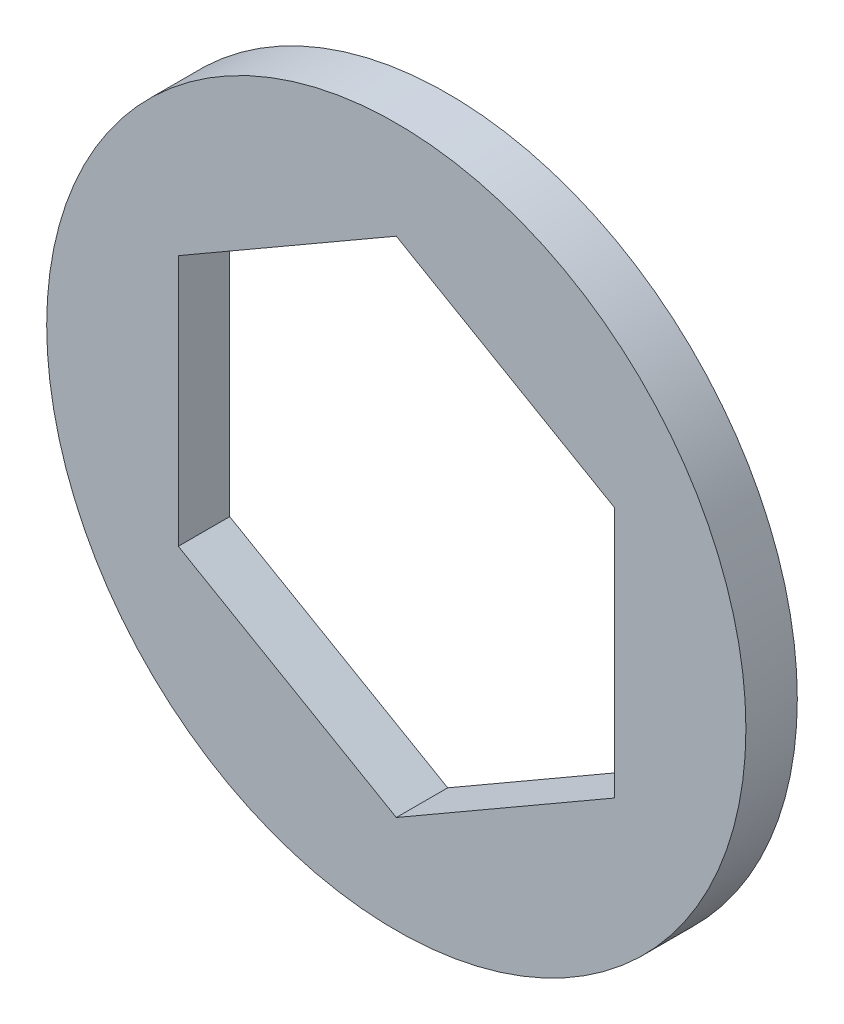
ISO-10303-21;
HEADER;
FILE_DESCRIPTION(('STEP AP214'),'2;1');
FILE_NAME('part.step','',(''),(''),'','','');
FILE_SCHEMA(('AUTOMOTIVE_DESIGN { 1 0 10303 214 1 1 1 1 }'));
ENDSEC;
DATA;
#1=APPLICATION_CONTEXT('core data for automotive mechanical design processes');
#2=APPLICATION_PROTOCOL_DEFINITION('international standard','automotive_design',2000,#1);
#3=PRODUCT_CONTEXT('',#1,'mechanical');
#4=PRODUCT('Part','Part','',(#3));
#5=PRODUCT_RELATED_PRODUCT_CATEGORY('part','',(#4));
#6=PRODUCT_DEFINITION_FORMATION('','',#4);
#7=PRODUCT_DEFINITION_CONTEXT('part definition',#1,'design');
#8=PRODUCT_DEFINITION('design','',#6,#7);
#9=PRODUCT_DEFINITION_SHAPE('','',#8);
#10=(LENGTH_UNIT() NAMED_UNIT(*) SI_UNIT(.MILLI.,.METRE.));
#11=(NAMED_UNIT(*) PLANE_ANGLE_UNIT() SI_UNIT($,.RADIAN.));
#12=(NAMED_UNIT(*) SI_UNIT($,.STERADIAN.) SOLID_ANGLE_UNIT());
#13=UNCERTAINTY_MEASURE_WITH_UNIT(LENGTH_MEASURE(1.E-05),#10,'distance_accuracy_value','');
#14=(GEOMETRIC_REPRESENTATION_CONTEXT(3) GLOBAL_UNCERTAINTY_ASSIGNED_CONTEXT((#13)) GLOBAL_UNIT_ASSIGNED_CONTEXT((#10,
#11,#12)) REPRESENTATION_CONTEXT('',''));
#15=CARTESIAN_POINT('',(0.,0.,0.));
#16=DIRECTION('',(0.,0.,1.));
#17=DIRECTION('',(1.,0.,0.));
#18=AXIS2_PLACEMENT_3D('',#15,#16,#17);
#19=CARTESIAN_POINT('',(0.,0.,1.5875));
#20=DIRECTION('',(0.,0.,1.));
#21=DIRECTION('',(1.,0.,0.));
#22=AXIS2_PLACEMENT_3D('',#19,#20,#21);
#23=PLANE('',#22);
#24=CARTESIAN_POINT('',(0.,0.,1.5875));
#25=DIRECTION('',(0.,0.,1.));
#26=DIRECTION('',(1.,0.,0.));
#27=AXIS2_PLACEMENT_3D('',#24,#25,#26);
#28=CIRCLE('',#27,10.795);
#29=CARTESIAN_POINT('',(10.795,0.,1.5875));
#30=VERTEX_POINT('',#29);
#31=EDGE_CURVE('E11',#30,#30,#28,.T.);
#32=ORIENTED_EDGE('',*,*,#31,.T.);
#33=EDGE_LOOP('',(#32));
#34=FACE_BOUND('',#33,.T.);
#35=DIRECTION('',(-0.866025403784439,-0.5,0.));
#36=VECTOR('',#35,1.);
#37=CARTESIAN_POINT('',(0.,7.77228932383074,1.5875));
#38=LINE('',#37,#36);
#39=CARTESIAN_POINT('',(0.,7.77228932383074,1.5875));
#40=VERTEX_POINT('',#39);
#41=CARTESIAN_POINT('',(-6.731,3.88614466191537,1.5875));
#42=VERTEX_POINT('',#41);
#43=EDGE_CURVE('E98',#40,#42,#38,.T.);
#44=ORIENTED_EDGE('',*,*,#43,.F.);
#45=DIRECTION('',(-0.866025403784439,0.5,0.));
#46=VECTOR('',#45,1.);
#47=CARTESIAN_POINT('',(6.731,3.88614466191537,1.5875));
#48=LINE('',#47,#46);
#49=CARTESIAN_POINT('',(6.731,3.88614466191537,1.5875));
#50=VERTEX_POINT('',#49);
#51=EDGE_CURVE('E90',#50,#40,#48,.T.);
#52=ORIENTED_EDGE('',*,*,#51,.F.);
#53=DIRECTION('',(0.,1.,0.));
#54=VECTOR('',#53,1.);
#55=CARTESIAN_POINT('',(6.731,-3.88614466191537,1.5875));
#56=LINE('',#55,#54);
#57=CARTESIAN_POINT('',(6.731,-3.88614466191537,1.5875));
#58=VERTEX_POINT('',#57);
#59=EDGE_CURVE('E118',#58,#50,#56,.T.);
#60=ORIENTED_EDGE('',*,*,#59,.F.);
#61=DIRECTION('',(0.866025403784439,0.5,0.));
#62=VECTOR('',#61,1.);
#63=CARTESIAN_POINT('',(0.,-7.77228932383074,1.5875));
#64=LINE('',#63,#62);
#65=CARTESIAN_POINT('',(0.,-7.77228932383074,1.5875));
#66=VERTEX_POINT('',#65);
#67=EDGE_CURVE('E116',#66,#58,#64,.T.);
#68=ORIENTED_EDGE('',*,*,#67,.F.);
#69=DIRECTION('',(0.866025403784439,-0.5,0.));
#70=VECTOR('',#69,1.);
#71=CARTESIAN_POINT('',(-6.731,-3.88614466191537,1.5875));
#72=LINE('',#71,#70);
#73=CARTESIAN_POINT('',(-6.731,-3.88614466191537,1.5875));
#74=VERTEX_POINT('',#73);
#75=EDGE_CURVE('E112',#74,#66,#72,.T.);
#76=ORIENTED_EDGE('',*,*,#75,.F.);
#77=DIRECTION('',(0.,-1.,0.));
#78=VECTOR('',#77,1.);
#79=CARTESIAN_POINT('',(-6.731,3.88614466191537,1.5875));
#80=LINE('',#79,#78);
#81=EDGE_CURVE('E110',#42,#74,#80,.T.);
#82=ORIENTED_EDGE('',*,*,#81,.F.);
#83=EDGE_LOOP('',(#44,#52,#60,#68,#76,#82));
#84=FACE_BOUND('',#83,.T.);
#85=ADVANCED_FACE('F37',(#34,#84),#23,.T.);
#86=CARTESIAN_POINT('',(0.,0.,0.));
#87=DIRECTION('',(0.,0.,1.));
#88=DIRECTION('',(1.,0.,0.));
#89=AXIS2_PLACEMENT_3D('',#86,#87,#88);
#90=PLANE('',#89);
#91=CARTESIAN_POINT('',(0.,0.,0.));
#92=DIRECTION('',(0.,0.,1.));
#93=DIRECTION('',(1.,0.,0.));
#94=AXIS2_PLACEMENT_3D('',#91,#92,#93);
#95=CIRCLE('',#94,10.795);
#96=CARTESIAN_POINT('',(10.795,0.,0.));
#97=VERTEX_POINT('',#96);
#98=EDGE_CURVE('E41',#97,#97,#95,.T.);
#99=ORIENTED_EDGE('',*,*,#98,.F.);
#100=EDGE_LOOP('',(#99));
#101=FACE_BOUND('',#100,.T.);
#102=DIRECTION('',(-0.866025403784439,0.5,0.));
#103=VECTOR('',#102,1.);
#104=CARTESIAN_POINT('',(6.731,3.88614466191537,0.));
#105=LINE('',#104,#103);
#106=CARTESIAN_POINT('',(6.731,3.88614466191537,0.));
#107=VERTEX_POINT('',#106);
#108=CARTESIAN_POINT('',(0.,7.77228932383074,0.));
#109=VERTEX_POINT('',#108);
#110=EDGE_CURVE('E60',#107,#109,#105,.T.);
#111=ORIENTED_EDGE('',*,*,#110,.T.);
#112=DIRECTION('',(-0.866025403784439,-0.5,0.));
#113=VECTOR('',#112,1.);
#114=CARTESIAN_POINT('',(0.,7.77228932383074,0.));
#115=LINE('',#114,#113);
#116=CARTESIAN_POINT('',(-6.731,3.88614466191537,0.));
#117=VERTEX_POINT('',#116);
#118=EDGE_CURVE('E105',#109,#117,#115,.T.);
#119=ORIENTED_EDGE('',*,*,#118,.T.);
#120=DIRECTION('',(0.,-1.,0.));
#121=VECTOR('',#120,1.);
#122=CARTESIAN_POINT('',(-6.731,3.88614466191537,0.));
#123=LINE('',#122,#121);
#124=CARTESIAN_POINT('',(-6.731,-3.88614466191537,0.));
#125=VERTEX_POINT('',#124);
#126=EDGE_CURVE('E122',#117,#125,#123,.T.);
#127=ORIENTED_EDGE('',*,*,#126,.T.);
#128=DIRECTION('',(0.866025403784439,-0.5,0.));
#129=VECTOR('',#128,1.);
#130=CARTESIAN_POINT('',(-6.731,-3.88614466191537,0.));
#131=LINE('',#130,#129);
#132=CARTESIAN_POINT('',(0.,-7.77228932383074,0.));
#133=VERTEX_POINT('',#132);
#134=EDGE_CURVE('E125',#125,#133,#131,.T.);
#135=ORIENTED_EDGE('',*,*,#134,.T.);
#136=DIRECTION('',(0.866025403784439,0.5,0.));
#137=VECTOR('',#136,1.);
#138=CARTESIAN_POINT('',(0.,-7.77228932383074,0.));
#139=LINE('',#138,#137);
#140=CARTESIAN_POINT('',(6.731,-3.88614466191537,0.));
#141=VERTEX_POINT('',#140);
#142=EDGE_CURVE('E128',#133,#141,#139,.T.);
#143=ORIENTED_EDGE('',*,*,#142,.T.);
#144=DIRECTION('',(0.,1.,0.));
#145=VECTOR('',#144,1.);
#146=CARTESIAN_POINT('',(6.731,-3.88614466191537,0.));
#147=LINE('',#146,#145);
#148=EDGE_CURVE('E99',#141,#107,#147,.T.);
#149=ORIENTED_EDGE('',*,*,#148,.T.);
#150=EDGE_LOOP('',(#111,#119,#127,#135,#143,#149));
#151=FACE_BOUND('',#150,.T.);
#152=ADVANCED_FACE('F145',(#101,#151),#90,.F.);
#153=CARTESIAN_POINT('',(0.,0.,1.5875));
#154=DIRECTION('',(0.,0.,-1.));
#155=DIRECTION('',(-1.,0.,0.));
#156=AXIS2_PLACEMENT_3D('',#153,#154,#155);
#157=CYLINDRICAL_SURFACE('',#156,10.795);
#158=ORIENTED_EDGE('',*,*,#31,.F.);
#159=EDGE_LOOP('',(#158));
#160=FACE_BOUND('',#159,.T.);
#161=ORIENTED_EDGE('',*,*,#98,.T.);
#162=EDGE_LOOP('',(#161));
#163=FACE_BOUND('',#162,.T.);
#164=ADVANCED_FACE('F39',(#160,#163),#157,.T.);
#165=CARTESIAN_POINT('',(6.731,3.88614466191537,1.5875));
#166=DIRECTION('',(-0.5,-0.866025403784439,0.));
#167=DIRECTION('',(0.866025403784439,-0.5,0.));
#168=AXIS2_PLACEMENT_3D('',#165,#166,#167);
#169=PLANE('',#168);
#170=ORIENTED_EDGE('',*,*,#110,.F.);
#171=DIRECTION('',(0.,0.,-1.));
#172=VECTOR('',#171,1.);
#173=CARTESIAN_POINT('',(6.731,3.88614466191537,1.5875));
#174=LINE('',#173,#172);
#175=EDGE_CURVE('E94',#50,#107,#174,.T.);
#176=ORIENTED_EDGE('',*,*,#175,.F.);
#177=ORIENTED_EDGE('',*,*,#51,.T.);
#178=DIRECTION('',(0.,0.,-1.));
#179=VECTOR('',#178,1.);
#180=CARTESIAN_POINT('',(0.,7.77228932383074,1.5875));
#181=LINE('',#180,#179);
#182=EDGE_CURVE('E93',#40,#109,#181,.T.);
#183=ORIENTED_EDGE('',*,*,#182,.T.);
#184=EDGE_LOOP('',(#170,#176,#177,#183));
#185=FACE_BOUND('',#184,.T.);
#186=ADVANCED_FACE('F92',(#185),#169,.T.);
#187=CARTESIAN_POINT('',(0.,7.77228932383074,1.5875));
#188=DIRECTION('',(0.5,-0.866025403784439,0.));
#189=DIRECTION('',(0.866025403784439,0.5,0.));
#190=AXIS2_PLACEMENT_3D('',#187,#188,#189);
#191=PLANE('',#190);
#192=ORIENTED_EDGE('',*,*,#118,.F.);
#193=ORIENTED_EDGE('',*,*,#182,.F.);
#194=ORIENTED_EDGE('',*,*,#43,.T.);
#195=DIRECTION('',(0.,0.,-1.));
#196=VECTOR('',#195,1.);
#197=CARTESIAN_POINT('',(-6.731,3.88614466191537,1.5875));
#198=LINE('',#197,#196);
#199=EDGE_CURVE('E106',#42,#117,#198,.T.);
#200=ORIENTED_EDGE('',*,*,#199,.T.);
#201=EDGE_LOOP('',(#192,#193,#194,#200));
#202=FACE_BOUND('',#201,.T.);
#203=ADVANCED_FACE('F102',(#202),#191,.T.);
#204=CARTESIAN_POINT('',(-6.731,3.88614466191537,1.5875));
#205=DIRECTION('',(1.,0.,0.));
#206=DIRECTION('',(0.,0.,-1.));
#207=AXIS2_PLACEMENT_3D('',#204,#205,#206);
#208=PLANE('',#207);
#209=ORIENTED_EDGE('',*,*,#126,.F.);
#210=ORIENTED_EDGE('',*,*,#199,.F.);
#211=ORIENTED_EDGE('',*,*,#81,.T.);
#212=DIRECTION('',(0.,0.,-1.));
#213=VECTOR('',#212,1.);
#214=CARTESIAN_POINT('',(-6.731,-3.88614466191537,1.5875));
#215=LINE('',#214,#213);
#216=EDGE_CURVE('E137',#74,#125,#215,.T.);
#217=ORIENTED_EDGE('',*,*,#216,.T.);
#218=EDGE_LOOP('',(#209,#210,#211,#217));
#219=FACE_BOUND('',#218,.T.);
#220=ADVANCED_FACE('F141',(#219),#208,.T.);
#221=CARTESIAN_POINT('',(-6.731,-3.88614466191537,1.5875));
#222=DIRECTION('',(0.5,0.866025403784438,0.));
#223=DIRECTION('',(-0.866025403784439,0.5,0.));
#224=AXIS2_PLACEMENT_3D('',#221,#222,#223);
#225=PLANE('',#224);
#226=ORIENTED_EDGE('',*,*,#134,.F.);
#227=ORIENTED_EDGE('',*,*,#216,.F.);
#228=ORIENTED_EDGE('',*,*,#75,.T.);
#229=DIRECTION('',(0.,0.,-1.));
#230=VECTOR('',#229,1.);
#231=CARTESIAN_POINT('',(0.,-7.77228932383074,1.5875));
#232=LINE('',#231,#230);
#233=EDGE_CURVE('E135',#66,#133,#232,.T.);
#234=ORIENTED_EDGE('',*,*,#233,.T.);
#235=EDGE_LOOP('',(#226,#227,#228,#234));
#236=FACE_BOUND('',#235,.T.);
#237=ADVANCED_FACE('F153',(#236),#225,.T.);
#238=CARTESIAN_POINT('',(0.,-7.77228932383074,1.5875));
#239=DIRECTION('',(-0.5,0.866025403784439,0.));
#240=DIRECTION('',(-0.866025403784439,-0.5,0.));
#241=AXIS2_PLACEMENT_3D('',#238,#239,#240);
#242=PLANE('',#241);
#243=ORIENTED_EDGE('',*,*,#142,.F.);
#244=ORIENTED_EDGE('',*,*,#233,.F.);
#245=ORIENTED_EDGE('',*,*,#67,.T.);
#246=DIRECTION('',(0.,0.,-1.));
#247=VECTOR('',#246,1.);
#248=CARTESIAN_POINT('',(6.731,-3.88614466191537,1.5875));
#249=LINE('',#248,#247);
#250=EDGE_CURVE('E52',#58,#141,#249,.T.);
#251=ORIENTED_EDGE('',*,*,#250,.T.);
#252=EDGE_LOOP('',(#243,#244,#245,#251));
#253=FACE_BOUND('',#252,.T.);
#254=ADVANCED_FACE('F151',(#253),#242,.T.);
#255=CARTESIAN_POINT('',(6.731,-3.88614466191537,1.5875));
#256=DIRECTION('',(-1.,0.,0.));
#257=DIRECTION('',(0.,-1.,0.));
#258=AXIS2_PLACEMENT_3D('',#255,#256,#257);
#259=PLANE('',#258);
#260=ORIENTED_EDGE('',*,*,#148,.F.);
#261=ORIENTED_EDGE('',*,*,#250,.F.);
#262=ORIENTED_EDGE('',*,*,#59,.T.);
#263=ORIENTED_EDGE('',*,*,#175,.T.);
#264=EDGE_LOOP('',(#260,#261,#262,#263));
#265=FACE_BOUND('',#264,.T.);
#266=ADVANCED_FACE('F147',(#265),#259,.T.);
#267=CLOSED_SHELL('',(#85,#152,#164,#186,#203,#220,#237,#254,#266));
#268=MANIFOLD_SOLID_BREP('B2',#267);
#269=ADVANCED_BREP_SHAPE_REPRESENTATION('',(#18,#268),#14);
#270=SHAPE_DEFINITION_REPRESENTATION(#9,#269);
ENDSEC;
END-ISO-10303-21;
